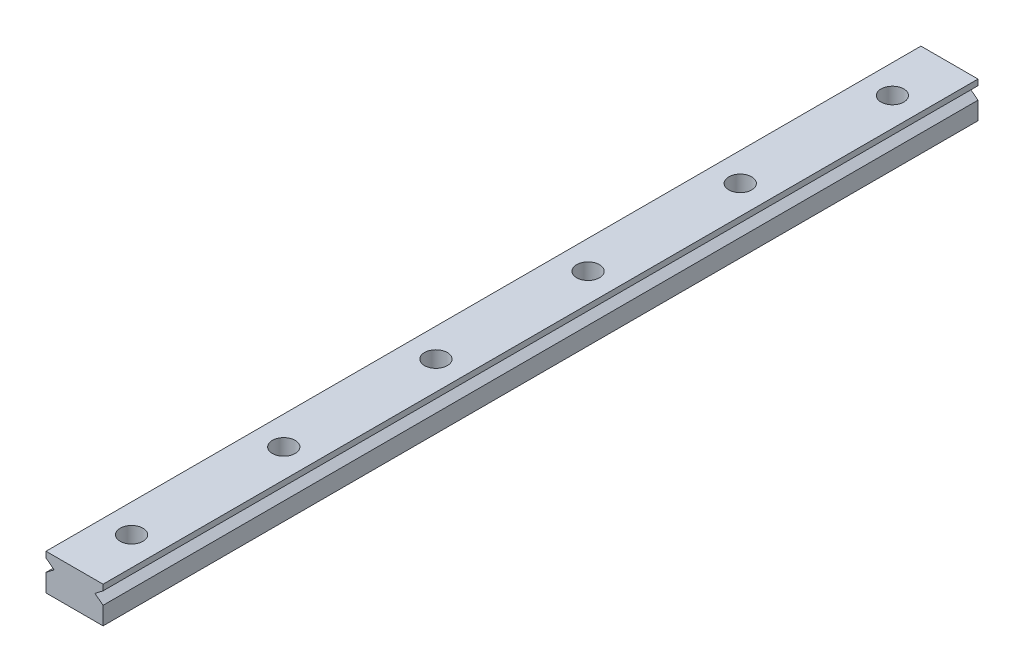
ISO-10303-21;
HEADER;
FILE_DESCRIPTION(('STEP AP214'),'2;1');
FILE_NAME('part.step','',(''),(''),'','','');
FILE_SCHEMA(('AUTOMOTIVE_DESIGN { 1 0 10303 214 1 1 1 1 }'));
ENDSEC;
DATA;
#1=APPLICATION_CONTEXT('core data for automotive mechanical design processes');
#2=APPLICATION_PROTOCOL_DEFINITION('international standard','automotive_design',2000,#1);
#3=PRODUCT_CONTEXT('',#1,'mechanical');
#4=PRODUCT('Part','Part','',(#3));
#5=PRODUCT_RELATED_PRODUCT_CATEGORY('part','',(#4));
#6=PRODUCT_DEFINITION_FORMATION('','',#4);
#7=PRODUCT_DEFINITION_CONTEXT('part definition',#1,'design');
#8=PRODUCT_DEFINITION('design','',#6,#7);
#9=PRODUCT_DEFINITION_SHAPE('','',#8);
#10=(LENGTH_UNIT() NAMED_UNIT(*) SI_UNIT(.MILLI.,.METRE.));
#11=(NAMED_UNIT(*) PLANE_ANGLE_UNIT() SI_UNIT($,.RADIAN.));
#12=(NAMED_UNIT(*) SI_UNIT($,.STERADIAN.) SOLID_ANGLE_UNIT());
#13=UNCERTAINTY_MEASURE_WITH_UNIT(LENGTH_MEASURE(1.E-05),#10,'distance_accuracy_value','');
#14=(GEOMETRIC_REPRESENTATION_CONTEXT(3) GLOBAL_UNCERTAINTY_ASSIGNED_CONTEXT((#13)) GLOBAL_UNIT_ASSIGNED_CONTEXT((#10,
#11,#12)) REPRESENTATION_CONTEXT('',''));
#15=CARTESIAN_POINT('',(0.,0.,0.));
#16=DIRECTION('',(0.,0.,1.));
#17=DIRECTION('',(1.,0.,0.));
#18=AXIS2_PLACEMENT_3D('',#15,#16,#17);
#19=CARTESIAN_POINT('',(-7.5,9.5,-230.));
#20=DIRECTION('',(0.,1.,0.));
#21=DIRECTION('',(0.,0.,1.));
#22=AXIS2_PLACEMENT_3D('',#19,#20,#21);
#23=PLANE('',#22);
#24=CARTESIAN_POINT('',(0.,9.5,-55.));
#25=DIRECTION('',(0.,1.,0.));
#26=DIRECTION('',(0.,0.,1.));
#27=AXIS2_PLACEMENT_3D('',#24,#25,#26);
#28=CIRCLE('',#27,3.);
#29=CARTESIAN_POINT('',(0.,9.5,-52.));
#30=VERTEX_POINT('',#29);
#31=EDGE_CURVE('E301',#30,#30,#28,.T.);
#32=ORIENTED_EDGE('',*,*,#31,.F.);
#33=EDGE_LOOP('',(#32));
#34=FACE_BOUND('',#33,.T.);
#35=CARTESIAN_POINT('',(0.,9.5,-135.));
#36=DIRECTION('',(0.,1.,0.));
#37=DIRECTION('',(0.,0.,1.));
#38=AXIS2_PLACEMENT_3D('',#35,#36,#37);
#39=CIRCLE('',#38,3.);
#40=CARTESIAN_POINT('',(0.,9.5,-132.));
#41=VERTEX_POINT('',#40);
#42=EDGE_CURVE('E277',#41,#41,#39,.T.);
#43=ORIENTED_EDGE('',*,*,#42,.F.);
#44=EDGE_LOOP('',(#43));
#45=FACE_BOUND('',#44,.T.);
#46=CARTESIAN_POINT('',(0.,9.5,-215.));
#47=DIRECTION('',(0.,1.,0.));
#48=DIRECTION('',(0.,0.,1.));
#49=AXIS2_PLACEMENT_3D('',#46,#47,#48);
#50=CIRCLE('',#49,3.);
#51=CARTESIAN_POINT('',(0.,9.5,-212.));
#52=VERTEX_POINT('',#51);
#53=EDGE_CURVE('E151',#52,#52,#50,.T.);
#54=ORIENTED_EDGE('',*,*,#53,.F.);
#55=EDGE_LOOP('',(#54));
#56=FACE_BOUND('',#55,.T.);
#57=DIRECTION('',(-1.,0.,0.));
#58=VECTOR('',#57,1.);
#59=CARTESIAN_POINT('',(-7.5,9.5,0.));
#60=LINE('',#59,#58);
#61=CARTESIAN_POINT('',(7.5,9.5,0.));
#62=VERTEX_POINT('',#61);
#63=CARTESIAN_POINT('',(-7.5,9.5,0.));
#64=VERTEX_POINT('',#63);
#65=EDGE_CURVE('E166',#62,#64,#60,.T.);
#66=ORIENTED_EDGE('',*,*,#65,.F.);
#67=DIRECTION('',(0.,0.,1.));
#68=VECTOR('',#67,1.);
#69=CARTESIAN_POINT('',(7.5,9.5,-230.));
#70=LINE('',#69,#68);
#71=CARTESIAN_POINT('',(7.5,9.5,-230.));
#72=VERTEX_POINT('',#71);
#73=EDGE_CURVE('E178',#72,#62,#70,.T.);
#74=ORIENTED_EDGE('',*,*,#73,.F.);
#75=DIRECTION('',(-1.,0.,0.));
#76=VECTOR('',#75,1.);
#77=CARTESIAN_POINT('',(-7.5,9.5,-230.));
#78=LINE('',#77,#76);
#79=CARTESIAN_POINT('',(-7.5,9.5,-230.));
#80=VERTEX_POINT('',#79);
#81=EDGE_CURVE('E140',#72,#80,#78,.T.);
#82=ORIENTED_EDGE('',*,*,#81,.T.);
#83=DIRECTION('',(0.,0.,1.));
#84=VECTOR('',#83,1.);
#85=CARTESIAN_POINT('',(-7.5,9.5,-230.));
#86=LINE('',#85,#84);
#87=EDGE_CURVE('E129',#80,#64,#86,.T.);
#88=ORIENTED_EDGE('',*,*,#87,.T.);
#89=EDGE_LOOP('',(#66,#74,#82,#88));
#90=FACE_BOUND('',#89,.T.);
#91=CARTESIAN_POINT('',(0.,9.5,-175.));
#92=DIRECTION('',(0.,1.,0.));
#93=DIRECTION('',(0.,0.,1.));
#94=AXIS2_PLACEMENT_3D('',#91,#92,#93);
#95=CIRCLE('',#94,3.);
#96=CARTESIAN_POINT('',(0.,9.5,-172.));
#97=VERTEX_POINT('',#96);
#98=EDGE_CURVE('E265',#97,#97,#95,.T.);
#99=ORIENTED_EDGE('',*,*,#98,.F.);
#100=EDGE_LOOP('',(#99));
#101=FACE_BOUND('',#100,.T.);
#102=CARTESIAN_POINT('',(0.,9.5,-95.));
#103=DIRECTION('',(0.,1.,0.));
#104=DIRECTION('',(0.,0.,1.));
#105=AXIS2_PLACEMENT_3D('',#102,#103,#104);
#106=CIRCLE('',#105,3.);
#107=CARTESIAN_POINT('',(0.,9.5,-92.));
#108=VERTEX_POINT('',#107);
#109=EDGE_CURVE('E289',#108,#108,#106,.T.);
#110=ORIENTED_EDGE('',*,*,#109,.F.);
#111=EDGE_LOOP('',(#110));
#112=FACE_BOUND('',#111,.T.);
#113=CARTESIAN_POINT('',(0.,9.5,-15.));
#114=DIRECTION('',(0.,1.,0.));
#115=DIRECTION('',(0.,0.,1.));
#116=AXIS2_PLACEMENT_3D('',#113,#114,#115);
#117=CIRCLE('',#116,3.);
#118=CARTESIAN_POINT('',(0.,9.5,-12.));
#119=VERTEX_POINT('',#118);
#120=EDGE_CURVE('E313',#119,#119,#117,.T.);
#121=ORIENTED_EDGE('',*,*,#120,.F.);
#122=EDGE_LOOP('',(#121));
#123=FACE_BOUND('',#122,.T.);
#124=ADVANCED_FACE('F37',(#34,#45,#56,#90,#101,#112,#123),#23,.T.);
#125=CARTESIAN_POINT('',(-7.5,0.,-230.));
#126=DIRECTION('',(0.,-1.,0.));
#127=DIRECTION('',(0.,0.,-1.));
#128=AXIS2_PLACEMENT_3D('',#125,#126,#127);
#129=PLANE('',#128);
#130=CARTESIAN_POINT('',(0.,0.,-55.));
#131=DIRECTION('',(0.,1.,0.));
#132=DIRECTION('',(0.,0.,1.));
#133=AXIS2_PLACEMENT_3D('',#130,#131,#132);
#134=CIRCLE('',#133,1.74999999999997);
#135=CARTESIAN_POINT('',(0.,0.,-53.25));
#136=VERTEX_POINT('',#135);
#137=EDGE_CURVE('E310',#136,#136,#134,.T.);
#138=ORIENTED_EDGE('',*,*,#137,.T.);
#139=EDGE_LOOP('',(#138));
#140=FACE_BOUND('',#139,.T.);
#141=CARTESIAN_POINT('',(0.,0.,-135.));
#142=DIRECTION('',(0.,1.,0.));
#143=DIRECTION('',(0.,0.,1.));
#144=AXIS2_PLACEMENT_3D('',#141,#142,#143);
#145=CIRCLE('',#144,1.74999999999997);
#146=CARTESIAN_POINT('',(0.,0.,-133.25));
#147=VERTEX_POINT('',#146);
#148=EDGE_CURVE('E286',#147,#147,#145,.T.);
#149=ORIENTED_EDGE('',*,*,#148,.T.);
#150=EDGE_LOOP('',(#149));
#151=FACE_BOUND('',#150,.T.);
#152=CARTESIAN_POINT('',(0.,0.,-215.));
#153=DIRECTION('',(0.,1.,0.));
#154=DIRECTION('',(0.,0.,1.));
#155=AXIS2_PLACEMENT_3D('',#152,#153,#154);
#156=CIRCLE('',#155,1.74999999999997);
#157=CARTESIAN_POINT('',(0.,0.,-213.25));
#158=VERTEX_POINT('',#157);
#159=EDGE_CURVE('E262',#158,#158,#156,.T.);
#160=ORIENTED_EDGE('',*,*,#159,.T.);
#161=EDGE_LOOP('',(#160));
#162=FACE_BOUND('',#161,.T.);
#163=DIRECTION('',(1.,0.,0.));
#164=VECTOR('',#163,1.);
#165=CARTESIAN_POINT('',(-7.5,0.,0.));
#166=LINE('',#165,#164);
#167=CARTESIAN_POINT('',(-7.5,0.,0.));
#168=VERTEX_POINT('',#167);
#169=CARTESIAN_POINT('',(7.5,0.,0.));
#170=VERTEX_POINT('',#169);
#171=EDGE_CURVE('E150',#168,#170,#166,.T.);
#172=ORIENTED_EDGE('',*,*,#171,.F.);
#173=DIRECTION('',(0.,0.,1.));
#174=VECTOR('',#173,1.);
#175=CARTESIAN_POINT('',(-7.5,0.,-230.));
#176=LINE('',#175,#174);
#177=CARTESIAN_POINT('',(-7.5,0.,-230.));
#178=VERTEX_POINT('',#177);
#179=EDGE_CURVE('E41',#178,#168,#176,.T.);
#180=ORIENTED_EDGE('',*,*,#179,.F.);
#181=DIRECTION('',(1.,0.,0.));
#182=VECTOR('',#181,1.);
#183=CARTESIAN_POINT('',(-7.5,0.,-230.));
#184=LINE('',#183,#182);
#185=CARTESIAN_POINT('',(7.5,0.,-230.));
#186=VERTEX_POINT('',#185);
#187=EDGE_CURVE('E251',#178,#186,#184,.T.);
#188=ORIENTED_EDGE('',*,*,#187,.T.);
#189=DIRECTION('',(0.,0.,1.));
#190=VECTOR('',#189,1.);
#191=CARTESIAN_POINT('',(7.5,0.,-230.));
#192=LINE('',#191,#190);
#193=EDGE_CURVE('E185',#186,#170,#192,.T.);
#194=ORIENTED_EDGE('',*,*,#193,.T.);
#195=EDGE_LOOP('',(#172,#180,#188,#194));
#196=FACE_BOUND('',#195,.T.);
#197=CARTESIAN_POINT('',(0.,0.,-175.));
#198=DIRECTION('',(0.,1.,0.));
#199=DIRECTION('',(0.,0.,1.));
#200=AXIS2_PLACEMENT_3D('',#197,#198,#199);
#201=CIRCLE('',#200,1.74999999999997);
#202=CARTESIAN_POINT('',(0.,0.,-173.25));
#203=VERTEX_POINT('',#202);
#204=EDGE_CURVE('E274',#203,#203,#201,.T.);
#205=ORIENTED_EDGE('',*,*,#204,.T.);
#206=EDGE_LOOP('',(#205));
#207=FACE_BOUND('',#206,.T.);
#208=CARTESIAN_POINT('',(0.,0.,-95.));
#209=DIRECTION('',(0.,1.,0.));
#210=DIRECTION('',(0.,0.,1.));
#211=AXIS2_PLACEMENT_3D('',#208,#209,#210);
#212=CIRCLE('',#211,1.74999999999997);
#213=CARTESIAN_POINT('',(0.,0.,-93.2500000000001));
#214=VERTEX_POINT('',#213);
#215=EDGE_CURVE('E298',#214,#214,#212,.T.);
#216=ORIENTED_EDGE('',*,*,#215,.T.);
#217=EDGE_LOOP('',(#216));
#218=FACE_BOUND('',#217,.T.);
#219=CARTESIAN_POINT('',(0.,0.,-15.));
#220=DIRECTION('',(0.,1.,0.));
#221=DIRECTION('',(0.,0.,1.));
#222=AXIS2_PLACEMENT_3D('',#219,#220,#221);
#223=CIRCLE('',#222,1.74999999999997);
#224=CARTESIAN_POINT('',(0.,0.,-13.25));
#225=VERTEX_POINT('',#224);
#226=EDGE_CURVE('E322',#225,#225,#223,.T.);
#227=ORIENTED_EDGE('',*,*,#226,.T.);
#228=EDGE_LOOP('',(#227));
#229=FACE_BOUND('',#228,.T.);
#230=ADVANCED_FACE('F187',(#140,#151,#162,#196,#207,#218,#229),#129,.T.);
#231=CARTESIAN_POINT('',(-7.5,0.,-230.));
#232=DIRECTION('',(-1.,0.,0.));
#233=DIRECTION('',(0.,0.,1.));
#234=AXIS2_PLACEMENT_3D('',#231,#232,#233);
#235=PLANE('',#234);
#236=DIRECTION('',(0.,-1.,0.));
#237=VECTOR('',#236,1.);
#238=CARTESIAN_POINT('',(-7.5,0.,0.));
#239=LINE('',#238,#237);
#240=CARTESIAN_POINT('',(-7.5,4.68906121623557,0.));
#241=VERTEX_POINT('',#240);
#242=EDGE_CURVE('E147',#241,#168,#239,.T.);
#243=ORIENTED_EDGE('',*,*,#242,.F.);
#244=DIRECTION('',(0.,0.,1.));
#245=VECTOR('',#244,1.);
#246=CARTESIAN_POINT('',(-7.5,4.68906121623557,-230.));
#247=LINE('',#246,#245);
#248=CARTESIAN_POINT('',(-7.5,4.68906121623557,-230.));
#249=VERTEX_POINT('',#248);
#250=EDGE_CURVE('E11',#249,#241,#247,.T.);
#251=ORIENTED_EDGE('',*,*,#250,.F.);
#252=DIRECTION('',(0.,-1.,0.));
#253=VECTOR('',#252,1.);
#254=CARTESIAN_POINT('',(-7.5,0.,-230.));
#255=LINE('',#254,#253);
#256=EDGE_CURVE('E174',#249,#178,#255,.T.);
#257=ORIENTED_EDGE('',*,*,#256,.T.);
#258=ORIENTED_EDGE('',*,*,#179,.T.);
#259=EDGE_LOOP('',(#243,#251,#257,#258));
#260=FACE_BOUND('',#259,.T.);
#261=ADVANCED_FACE('F39',(#260),#235,.T.);
#262=CARTESIAN_POINT('',(-5.35714285714286,6.33333333333333,-230.));
#263=DIRECTION('',(-0.608761429008718,0.793353340291237,0.));
#264=DIRECTION('',(-0.793353340291238,-0.608761429008718,0.));
#265=AXIS2_PLACEMENT_3D('',#262,#263,#264);
#266=PLANE('',#265);
#267=DIRECTION('',(-0.793353340291238,-0.608761429008718,0.));
#268=VECTOR('',#267,1.);
#269=CARTESIAN_POINT('',(-5.35714285714286,6.33333333333333,0.));
#270=LINE('',#269,#268);
#271=CARTESIAN_POINT('',(-5.35714285714286,6.33333333333333,0.));
#272=VERTEX_POINT('',#271);
#273=EDGE_CURVE('E172',#272,#241,#270,.T.);
#274=ORIENTED_EDGE('',*,*,#273,.F.);
#275=DIRECTION('',(0.,0.,1.));
#276=VECTOR('',#275,1.);
#277=CARTESIAN_POINT('',(-5.35714285714286,6.33333333333333,-230.));
#278=LINE('',#277,#276);
#279=CARTESIAN_POINT('',(-5.35714285714286,6.33333333333333,-230.));
#280=VERTEX_POINT('',#279);
#281=EDGE_CURVE('E47',#280,#272,#278,.T.);
#282=ORIENTED_EDGE('',*,*,#281,.F.);
#283=DIRECTION('',(-0.793353340291238,-0.608761429008718,0.));
#284=VECTOR('',#283,1.);
#285=CARTESIAN_POINT('',(-5.35714285714286,6.33333333333333,-230.));
#286=LINE('',#285,#284);
#287=EDGE_CURVE('E137',#280,#249,#286,.T.);
#288=ORIENTED_EDGE('',*,*,#287,.T.);
#289=ORIENTED_EDGE('',*,*,#250,.T.);
#290=EDGE_LOOP('',(#274,#282,#288,#289));
#291=FACE_BOUND('',#290,.T.);
#292=ADVANCED_FACE('F191',(#291),#266,.T.);
#293=CARTESIAN_POINT('',(-7.5,7.97760545043109,-230.));
#294=DIRECTION('',(-0.608761429008718,-0.793353340291237,0.));
#295=DIRECTION('',(0.793353340291238,-0.608761429008718,0.));
#296=AXIS2_PLACEMENT_3D('',#293,#294,#295);
#297=PLANE('',#296);
#298=DIRECTION('',(0.793353340291238,-0.608761429008718,0.));
#299=VECTOR('',#298,1.);
#300=CARTESIAN_POINT('',(-7.5,7.97760545043109,0.));
#301=LINE('',#300,#299);
#302=CARTESIAN_POINT('',(-7.5,7.97760545043109,0.));
#303=VERTEX_POINT('',#302);
#304=EDGE_CURVE('E124',#303,#272,#301,.T.);
#305=ORIENTED_EDGE('',*,*,#304,.F.);
#306=DIRECTION('',(0.,0.,1.));
#307=VECTOR('',#306,1.);
#308=CARTESIAN_POINT('',(-7.5,7.97760545043109,-230.));
#309=LINE('',#308,#307);
#310=CARTESIAN_POINT('',(-7.5,7.97760545043109,-230.));
#311=VERTEX_POINT('',#310);
#312=EDGE_CURVE('E119',#311,#303,#309,.T.);
#313=ORIENTED_EDGE('',*,*,#312,.F.);
#314=DIRECTION('',(0.793353340291238,-0.608761429008718,0.));
#315=VECTOR('',#314,1.);
#316=CARTESIAN_POINT('',(-7.5,7.97760545043109,-230.));
#317=LINE('',#316,#315);
#318=EDGE_CURVE('E122',#311,#280,#317,.T.);
#319=ORIENTED_EDGE('',*,*,#318,.T.);
#320=ORIENTED_EDGE('',*,*,#281,.T.);
#321=EDGE_LOOP('',(#305,#313,#319,#320));
#322=FACE_BOUND('',#321,.T.);
#323=ADVANCED_FACE('F121',(#322),#297,.T.);
#324=CARTESIAN_POINT('',(-7.5,7.97760545043109,-230.));
#325=DIRECTION('',(-1.,0.,0.));
#326=DIRECTION('',(0.,0.,1.));
#327=AXIS2_PLACEMENT_3D('',#324,#325,#326);
#328=PLANE('',#327);
#329=DIRECTION('',(0.,-1.,0.));
#330=VECTOR('',#329,1.);
#331=CARTESIAN_POINT('',(-7.5,7.97760545043109,0.));
#332=LINE('',#331,#330);
#333=EDGE_CURVE('E169',#64,#303,#332,.T.);
#334=ORIENTED_EDGE('',*,*,#333,.F.);
#335=ORIENTED_EDGE('',*,*,#87,.F.);
#336=DIRECTION('',(0.,-1.,0.));
#337=VECTOR('',#336,1.);
#338=CARTESIAN_POINT('',(-7.5,7.97760545043109,-230.));
#339=LINE('',#338,#337);
#340=EDGE_CURVE('E135',#80,#311,#339,.T.);
#341=ORIENTED_EDGE('',*,*,#340,.T.);
#342=ORIENTED_EDGE('',*,*,#312,.T.);
#343=EDGE_LOOP('',(#334,#335,#341,#342));
#344=FACE_BOUND('',#343,.T.);
#345=ADVANCED_FACE('F139',(#344),#328,.T.);
#346=CARTESIAN_POINT('',(7.5,7.97760545043109,-230.));
#347=DIRECTION('',(1.,0.,0.));
#348=DIRECTION('',(0.,0.,-1.));
#349=AXIS2_PLACEMENT_3D('',#346,#347,#348);
#350=PLANE('',#349);
#351=DIRECTION('',(0.,1.,0.));
#352=VECTOR('',#351,1.);
#353=CARTESIAN_POINT('',(7.5,7.97760545043109,0.));
#354=LINE('',#353,#352);
#355=CARTESIAN_POINT('',(7.5,7.97760545043109,0.));
#356=VERTEX_POINT('',#355);
#357=EDGE_CURVE('E163',#356,#62,#354,.T.);
#358=ORIENTED_EDGE('',*,*,#357,.F.);
#359=DIRECTION('',(0.,0.,1.));
#360=VECTOR('',#359,1.);
#361=CARTESIAN_POINT('',(7.5,7.97760545043109,-230.));
#362=LINE('',#361,#360);
#363=CARTESIAN_POINT('',(7.5,7.97760545043109,-230.));
#364=VERTEX_POINT('',#363);
#365=EDGE_CURVE('E180',#364,#356,#362,.T.);
#366=ORIENTED_EDGE('',*,*,#365,.F.);
#367=DIRECTION('',(0.,1.,0.));
#368=VECTOR('',#367,1.);
#369=CARTESIAN_POINT('',(7.5,7.97760545043109,-230.));
#370=LINE('',#369,#368);
#371=EDGE_CURVE('E142',#364,#72,#370,.T.);
#372=ORIENTED_EDGE('',*,*,#371,.T.);
#373=ORIENTED_EDGE('',*,*,#73,.T.);
#374=EDGE_LOOP('',(#358,#366,#372,#373));
#375=FACE_BOUND('',#374,.T.);
#376=ADVANCED_FACE('F211',(#375),#350,.T.);
#377=CARTESIAN_POINT('',(7.5,7.97760545043109,-230.));
#378=DIRECTION('',(0.608761429008718,-0.793353340291237,0.));
#379=DIRECTION('',(0.793353340291238,0.608761429008718,0.));
#380=AXIS2_PLACEMENT_3D('',#377,#378,#379);
#381=PLANE('',#380);
#382=DIRECTION('',(0.793353340291238,0.608761429008718,0.));
#383=VECTOR('',#382,1.);
#384=CARTESIAN_POINT('',(7.5,7.97760545043109,0.));
#385=LINE('',#384,#383);
#386=CARTESIAN_POINT('',(5.35714285714286,6.33333333333333,0.));
#387=VERTEX_POINT('',#386);
#388=EDGE_CURVE('E160',#387,#356,#385,.T.);
#389=ORIENTED_EDGE('',*,*,#388,.F.);
#390=DIRECTION('',(0.,0.,1.));
#391=VECTOR('',#390,1.);
#392=CARTESIAN_POINT('',(5.35714285714286,6.33333333333333,-230.));
#393=LINE('',#392,#391);
#394=CARTESIAN_POINT('',(5.35714285714286,6.33333333333333,-230.));
#395=VERTEX_POINT('',#394);
#396=EDGE_CURVE('E182',#395,#387,#393,.T.);
#397=ORIENTED_EDGE('',*,*,#396,.F.);
#398=DIRECTION('',(0.793353340291238,0.608761429008718,0.));
#399=VECTOR('',#398,1.);
#400=CARTESIAN_POINT('',(7.5,7.97760545043109,-230.));
#401=LINE('',#400,#399);
#402=EDGE_CURVE('E240',#395,#364,#401,.T.);
#403=ORIENTED_EDGE('',*,*,#402,.T.);
#404=ORIENTED_EDGE('',*,*,#365,.T.);
#405=EDGE_LOOP('',(#389,#397,#403,#404));
#406=FACE_BOUND('',#405,.T.);
#407=ADVANCED_FACE('F214',(#406),#381,.T.);
#408=CARTESIAN_POINT('',(5.35714285714286,6.33333333333333,-230.));
#409=DIRECTION('',(0.608761429008718,0.793353340291237,0.));
#410=DIRECTION('',(-0.793353340291238,0.608761429008718,0.));
#411=AXIS2_PLACEMENT_3D('',#408,#409,#410);
#412=PLANE('',#411);
#413=DIRECTION('',(-0.793353340291238,0.608761429008718,0.));
#414=VECTOR('',#413,1.);
#415=CARTESIAN_POINT('',(5.35714285714286,6.33333333333333,0.));
#416=LINE('',#415,#414);
#417=CARTESIAN_POINT('',(7.5,4.68906121623557,0.));
#418=VERTEX_POINT('',#417);
#419=EDGE_CURVE('E157',#418,#387,#416,.T.);
#420=ORIENTED_EDGE('',*,*,#419,.F.);
#421=DIRECTION('',(0.,0.,1.));
#422=VECTOR('',#421,1.);
#423=CARTESIAN_POINT('',(7.5,4.68906121623557,-230.));
#424=LINE('',#423,#422);
#425=CARTESIAN_POINT('',(7.5,4.68906121623557,-230.));
#426=VERTEX_POINT('',#425);
#427=EDGE_CURVE('E184',#426,#418,#424,.T.);
#428=ORIENTED_EDGE('',*,*,#427,.F.);
#429=DIRECTION('',(-0.793353340291238,0.608761429008718,0.));
#430=VECTOR('',#429,1.);
#431=CARTESIAN_POINT('',(5.35714285714286,6.33333333333333,-230.));
#432=LINE('',#431,#430);
#433=EDGE_CURVE('E236',#426,#395,#432,.T.);
#434=ORIENTED_EDGE('',*,*,#433,.T.);
#435=ORIENTED_EDGE('',*,*,#396,.T.);
#436=EDGE_LOOP('',(#420,#428,#434,#435));
#437=FACE_BOUND('',#436,.T.);
#438=ADVANCED_FACE('F218',(#437),#412,.T.);
#439=CARTESIAN_POINT('',(7.5,0.,-230.));
#440=DIRECTION('',(1.,0.,0.));
#441=DIRECTION('',(0.,0.,-1.));
#442=AXIS2_PLACEMENT_3D('',#439,#440,#441);
#443=PLANE('',#442);
#444=DIRECTION('',(0.,1.,0.));
#445=VECTOR('',#444,1.);
#446=CARTESIAN_POINT('',(7.5,0.,0.));
#447=LINE('',#446,#445);
#448=EDGE_CURVE('E154',#170,#418,#447,.T.);
#449=ORIENTED_EDGE('',*,*,#448,.F.);
#450=ORIENTED_EDGE('',*,*,#193,.F.);
#451=DIRECTION('',(0.,1.,0.));
#452=VECTOR('',#451,1.);
#453=CARTESIAN_POINT('',(7.5,0.,-230.));
#454=LINE('',#453,#452);
#455=EDGE_CURVE('E249',#186,#426,#454,.T.);
#456=ORIENTED_EDGE('',*,*,#455,.T.);
#457=ORIENTED_EDGE('',*,*,#427,.T.);
#458=EDGE_LOOP('',(#449,#450,#456,#457));
#459=FACE_BOUND('',#458,.T.);
#460=ADVANCED_FACE('F222',(#459),#443,.T.);
#461=CARTESIAN_POINT('',(-7.5,9.5,-230.));
#462=DIRECTION('',(0.,0.,-1.));
#463=DIRECTION('',(-1.,0.,0.));
#464=AXIS2_PLACEMENT_3D('',#461,#462,#463);
#465=PLANE('',#464);
#466=ORIENTED_EDGE('',*,*,#256,.F.);
#467=ORIENTED_EDGE('',*,*,#287,.F.);
#468=ORIENTED_EDGE('',*,*,#318,.F.);
#469=ORIENTED_EDGE('',*,*,#340,.F.);
#470=ORIENTED_EDGE('',*,*,#81,.F.);
#471=ORIENTED_EDGE('',*,*,#371,.F.);
#472=ORIENTED_EDGE('',*,*,#402,.F.);
#473=ORIENTED_EDGE('',*,*,#433,.F.);
#474=ORIENTED_EDGE('',*,*,#455,.F.);
#475=ORIENTED_EDGE('',*,*,#187,.F.);
#476=EDGE_LOOP('',(#466,#467,#468,#469,#470,#471,#472,#473,#474,#475));
#477=FACE_BOUND('',#476,.T.);
#478=ADVANCED_FACE('F133',(#477),#465,.T.);
#479=CARTESIAN_POINT('',(-7.5,9.5,0.));
#480=DIRECTION('',(0.,0.,-1.));
#481=DIRECTION('',(-1.,0.,0.));
#482=AXIS2_PLACEMENT_3D('',#479,#480,#481);
#483=PLANE('',#482);
#484=ORIENTED_EDGE('',*,*,#242,.T.);
#485=ORIENTED_EDGE('',*,*,#171,.T.);
#486=ORIENTED_EDGE('',*,*,#448,.T.);
#487=ORIENTED_EDGE('',*,*,#419,.T.);
#488=ORIENTED_EDGE('',*,*,#388,.T.);
#489=ORIENTED_EDGE('',*,*,#357,.T.);
#490=ORIENTED_EDGE('',*,*,#65,.T.);
#491=ORIENTED_EDGE('',*,*,#333,.T.);
#492=ORIENTED_EDGE('',*,*,#304,.T.);
#493=ORIENTED_EDGE('',*,*,#273,.T.);
#494=EDGE_LOOP('',(#484,#485,#486,#487,#488,#489,#490,#491,#492,#493));
#495=FACE_BOUND('',#494,.T.);
#496=ADVANCED_FACE('F190',(#495),#483,.F.);
#497=CARTESIAN_POINT('',(0.,8.90490543455157,-215.));
#498=DIRECTION('',(0.,1.,0.));
#499=DIRECTION('',(0.,0.,1.));
#500=AXIS2_PLACEMENT_3D('',#497,#498,#499);
#501=CYLINDRICAL_SURFACE('',#500,3.);
#502=ORIENTED_EDGE('',*,*,#53,.T.);
#503=EDGE_LOOP('',(#502));
#504=FACE_BOUND('',#503,.T.);
#505=CARTESIAN_POINT('',(0.,5.,-215.));
#506=DIRECTION('',(0.,1.,0.));
#507=DIRECTION('',(0.,0.,1.));
#508=AXIS2_PLACEMENT_3D('',#505,#506,#507);
#509=CIRCLE('',#508,3.);
#510=CARTESIAN_POINT('',(0.,5.,-212.));
#511=VERTEX_POINT('',#510);
#512=EDGE_CURVE('E256',#511,#511,#509,.T.);
#513=ORIENTED_EDGE('',*,*,#512,.F.);
#514=EDGE_LOOP('',(#513));
#515=FACE_BOUND('',#514,.T.);
#516=ADVANCED_FACE('F397',(#504,#515),#501,.F.);
#517=CARTESIAN_POINT('',(0.,5.,-218.));
#518=DIRECTION('',(0.,1.,0.));
#519=DIRECTION('',(0.,0.,1.));
#520=AXIS2_PLACEMENT_3D('',#517,#518,#519);
#521=PLANE('',#520);
#522=ORIENTED_EDGE('',*,*,#512,.T.);
#523=EDGE_LOOP('',(#522));
#524=FACE_BOUND('',#523,.T.);
#525=CARTESIAN_POINT('',(0.,5.,-215.));
#526=DIRECTION('',(0.,1.,0.));
#527=DIRECTION('',(0.,0.,1.));
#528=AXIS2_PLACEMENT_3D('',#525,#526,#527);
#529=CIRCLE('',#528,1.74999999999997);
#530=CARTESIAN_POINT('',(0.,5.,-213.25));
#531=VERTEX_POINT('',#530);
#532=EDGE_CURVE('E259',#531,#531,#529,.T.);
#533=ORIENTED_EDGE('',*,*,#532,.F.);
#534=EDGE_LOOP('',(#533));
#535=FACE_BOUND('',#534,.T.);
#536=ADVANCED_FACE('F393',(#524,#535),#521,.T.);
#537=CARTESIAN_POINT('',(0.,8.90490543455157,-215.));
#538=DIRECTION('',(0.,1.,0.));
#539=DIRECTION('',(0.,0.,1.));
#540=AXIS2_PLACEMENT_3D('',#537,#538,#539);
#541=CYLINDRICAL_SURFACE('',#540,1.74999999999997);
#542=ORIENTED_EDGE('',*,*,#532,.T.);
#543=EDGE_LOOP('',(#542));
#544=FACE_BOUND('',#543,.T.);
#545=ORIENTED_EDGE('',*,*,#159,.F.);
#546=EDGE_LOOP('',(#545));
#547=FACE_BOUND('',#546,.T.);
#548=ADVANCED_FACE('F389',(#544,#547),#541,.F.);
#549=CARTESIAN_POINT('',(0.,8.90490543455157,-175.));
#550=DIRECTION('',(0.,1.,0.));
#551=DIRECTION('',(0.,0.,1.));
#552=AXIS2_PLACEMENT_3D('',#549,#550,#551);
#553=CYLINDRICAL_SURFACE('',#552,3.);
#554=ORIENTED_EDGE('',*,*,#98,.T.);
#555=EDGE_LOOP('',(#554));
#556=FACE_BOUND('',#555,.T.);
#557=CARTESIAN_POINT('',(0.,5.,-175.));
#558=DIRECTION('',(0.,1.,0.));
#559=DIRECTION('',(0.,0.,1.));
#560=AXIS2_PLACEMENT_3D('',#557,#558,#559);
#561=CIRCLE('',#560,3.);
#562=CARTESIAN_POINT('',(0.,5.,-172.));
#563=VERTEX_POINT('',#562);
#564=EDGE_CURVE('E268',#563,#563,#561,.T.);
#565=ORIENTED_EDGE('',*,*,#564,.F.);
#566=EDGE_LOOP('',(#565));
#567=FACE_BOUND('',#566,.T.);
#568=ADVANCED_FACE('F385',(#556,#567),#553,.F.);
#569=CARTESIAN_POINT('',(0.,5.,-178.));
#570=DIRECTION('',(0.,1.,0.));
#571=DIRECTION('',(0.,0.,1.));
#572=AXIS2_PLACEMENT_3D('',#569,#570,#571);
#573=PLANE('',#572);
#574=ORIENTED_EDGE('',*,*,#564,.T.);
#575=EDGE_LOOP('',(#574));
#576=FACE_BOUND('',#575,.T.);
#577=CARTESIAN_POINT('',(0.,5.,-175.));
#578=DIRECTION('',(0.,1.,0.));
#579=DIRECTION('',(0.,0.,1.));
#580=AXIS2_PLACEMENT_3D('',#577,#578,#579);
#581=CIRCLE('',#580,1.74999999999997);
#582=CARTESIAN_POINT('',(0.,5.,-173.25));
#583=VERTEX_POINT('',#582);
#584=EDGE_CURVE('E271',#583,#583,#581,.T.);
#585=ORIENTED_EDGE('',*,*,#584,.F.);
#586=EDGE_LOOP('',(#585));
#587=FACE_BOUND('',#586,.T.);
#588=ADVANCED_FACE('F381',(#576,#587),#573,.T.);
#589=CARTESIAN_POINT('',(0.,8.90490543455157,-175.));
#590=DIRECTION('',(0.,1.,0.));
#591=DIRECTION('',(0.,0.,1.));
#592=AXIS2_PLACEMENT_3D('',#589,#590,#591);
#593=CYLINDRICAL_SURFACE('',#592,1.74999999999997);
#594=ORIENTED_EDGE('',*,*,#584,.T.);
#595=EDGE_LOOP('',(#594));
#596=FACE_BOUND('',#595,.T.);
#597=ORIENTED_EDGE('',*,*,#204,.F.);
#598=EDGE_LOOP('',(#597));
#599=FACE_BOUND('',#598,.T.);
#600=ADVANCED_FACE('F377',(#596,#599),#593,.F.);
#601=CARTESIAN_POINT('',(0.,8.90490543455157,-135.));
#602=DIRECTION('',(0.,1.,0.));
#603=DIRECTION('',(0.,0.,1.));
#604=AXIS2_PLACEMENT_3D('',#601,#602,#603);
#605=CYLINDRICAL_SURFACE('',#604,3.);
#606=ORIENTED_EDGE('',*,*,#42,.T.);
#607=EDGE_LOOP('',(#606));
#608=FACE_BOUND('',#607,.T.);
#609=CARTESIAN_POINT('',(0.,5.,-135.));
#610=DIRECTION('',(0.,1.,0.));
#611=DIRECTION('',(0.,0.,1.));
#612=AXIS2_PLACEMENT_3D('',#609,#610,#611);
#613=CIRCLE('',#612,3.);
#614=CARTESIAN_POINT('',(0.,5.,-132.));
#615=VERTEX_POINT('',#614);
#616=EDGE_CURVE('E280',#615,#615,#613,.T.);
#617=ORIENTED_EDGE('',*,*,#616,.F.);
#618=EDGE_LOOP('',(#617));
#619=FACE_BOUND('',#618,.T.);
#620=ADVANCED_FACE('F373',(#608,#619),#605,.F.);
#621=CARTESIAN_POINT('',(0.,5.,-138.));
#622=DIRECTION('',(0.,1.,0.));
#623=DIRECTION('',(0.,0.,1.));
#624=AXIS2_PLACEMENT_3D('',#621,#622,#623);
#625=PLANE('',#624);
#626=ORIENTED_EDGE('',*,*,#616,.T.);
#627=EDGE_LOOP('',(#626));
#628=FACE_BOUND('',#627,.T.);
#629=CARTESIAN_POINT('',(0.,5.,-135.));
#630=DIRECTION('',(0.,1.,0.));
#631=DIRECTION('',(0.,0.,1.));
#632=AXIS2_PLACEMENT_3D('',#629,#630,#631);
#633=CIRCLE('',#632,1.74999999999997);
#634=CARTESIAN_POINT('',(0.,5.,-133.25));
#635=VERTEX_POINT('',#634);
#636=EDGE_CURVE('E283',#635,#635,#633,.T.);
#637=ORIENTED_EDGE('',*,*,#636,.F.);
#638=EDGE_LOOP('',(#637));
#639=FACE_BOUND('',#638,.T.);
#640=ADVANCED_FACE('F369',(#628,#639),#625,.T.);
#641=CARTESIAN_POINT('',(0.,8.90490543455157,-135.));
#642=DIRECTION('',(0.,1.,0.));
#643=DIRECTION('',(0.,0.,1.));
#644=AXIS2_PLACEMENT_3D('',#641,#642,#643);
#645=CYLINDRICAL_SURFACE('',#644,1.74999999999997);
#646=ORIENTED_EDGE('',*,*,#636,.T.);
#647=EDGE_LOOP('',(#646));
#648=FACE_BOUND('',#647,.T.);
#649=ORIENTED_EDGE('',*,*,#148,.F.);
#650=EDGE_LOOP('',(#649));
#651=FACE_BOUND('',#650,.T.);
#652=ADVANCED_FACE('F365',(#648,#651),#645,.F.);
#653=CARTESIAN_POINT('',(0.,8.90490543455157,-95.));
#654=DIRECTION('',(0.,1.,0.));
#655=DIRECTION('',(0.,0.,1.));
#656=AXIS2_PLACEMENT_3D('',#653,#654,#655);
#657=CYLINDRICAL_SURFACE('',#656,3.);
#658=ORIENTED_EDGE('',*,*,#109,.T.);
#659=EDGE_LOOP('',(#658));
#660=FACE_BOUND('',#659,.T.);
#661=CARTESIAN_POINT('',(0.,5.,-95.));
#662=DIRECTION('',(0.,1.,0.));
#663=DIRECTION('',(0.,0.,1.));
#664=AXIS2_PLACEMENT_3D('',#661,#662,#663);
#665=CIRCLE('',#664,3.);
#666=CARTESIAN_POINT('',(0.,5.,-92.));
#667=VERTEX_POINT('',#666);
#668=EDGE_CURVE('E292',#667,#667,#665,.T.);
#669=ORIENTED_EDGE('',*,*,#668,.F.);
#670=EDGE_LOOP('',(#669));
#671=FACE_BOUND('',#670,.T.);
#672=ADVANCED_FACE('F361',(#660,#671),#657,.F.);
#673=CARTESIAN_POINT('',(0.,5.,-98.));
#674=DIRECTION('',(0.,1.,0.));
#675=DIRECTION('',(0.,0.,1.));
#676=AXIS2_PLACEMENT_3D('',#673,#674,#675);
#677=PLANE('',#676);
#678=ORIENTED_EDGE('',*,*,#668,.T.);
#679=EDGE_LOOP('',(#678));
#680=FACE_BOUND('',#679,.T.);
#681=CARTESIAN_POINT('',(0.,5.,-95.));
#682=DIRECTION('',(0.,1.,0.));
#683=DIRECTION('',(0.,0.,1.));
#684=AXIS2_PLACEMENT_3D('',#681,#682,#683);
#685=CIRCLE('',#684,1.74999999999997);
#686=CARTESIAN_POINT('',(0.,5.,-93.2500000000001));
#687=VERTEX_POINT('',#686);
#688=EDGE_CURVE('E295',#687,#687,#685,.T.);
#689=ORIENTED_EDGE('',*,*,#688,.F.);
#690=EDGE_LOOP('',(#689));
#691=FACE_BOUND('',#690,.T.);
#692=ADVANCED_FACE('F357',(#680,#691),#677,.T.);
#693=CARTESIAN_POINT('',(0.,8.90490543455157,-95.));
#694=DIRECTION('',(0.,1.,0.));
#695=DIRECTION('',(0.,0.,1.));
#696=AXIS2_PLACEMENT_3D('',#693,#694,#695);
#697=CYLINDRICAL_SURFACE('',#696,1.74999999999997);
#698=ORIENTED_EDGE('',*,*,#688,.T.);
#699=EDGE_LOOP('',(#698));
#700=FACE_BOUND('',#699,.T.);
#701=ORIENTED_EDGE('',*,*,#215,.F.);
#702=EDGE_LOOP('',(#701));
#703=FACE_BOUND('',#702,.T.);
#704=ADVANCED_FACE('F353',(#700,#703),#697,.F.);
#705=CARTESIAN_POINT('',(0.,8.90490543455157,-55.));
#706=DIRECTION('',(0.,1.,0.));
#707=DIRECTION('',(0.,0.,1.));
#708=AXIS2_PLACEMENT_3D('',#705,#706,#707);
#709=CYLINDRICAL_SURFACE('',#708,3.);
#710=ORIENTED_EDGE('',*,*,#31,.T.);
#711=EDGE_LOOP('',(#710));
#712=FACE_BOUND('',#711,.T.);
#713=CARTESIAN_POINT('',(0.,5.,-55.));
#714=DIRECTION('',(0.,1.,0.));
#715=DIRECTION('',(0.,0.,1.));
#716=AXIS2_PLACEMENT_3D('',#713,#714,#715);
#717=CIRCLE('',#716,3.);
#718=CARTESIAN_POINT('',(0.,5.,-52.));
#719=VERTEX_POINT('',#718);
#720=EDGE_CURVE('E304',#719,#719,#717,.T.);
#721=ORIENTED_EDGE('',*,*,#720,.F.);
#722=EDGE_LOOP('',(#721));
#723=FACE_BOUND('',#722,.T.);
#724=ADVANCED_FACE('F349',(#712,#723),#709,.F.);
#725=CARTESIAN_POINT('',(0.,5.,-58.));
#726=DIRECTION('',(0.,1.,0.));
#727=DIRECTION('',(0.,0.,1.));
#728=AXIS2_PLACEMENT_3D('',#725,#726,#727);
#729=PLANE('',#728);
#730=ORIENTED_EDGE('',*,*,#720,.T.);
#731=EDGE_LOOP('',(#730));
#732=FACE_BOUND('',#731,.T.);
#733=CARTESIAN_POINT('',(0.,5.,-55.));
#734=DIRECTION('',(0.,1.,0.));
#735=DIRECTION('',(0.,0.,1.));
#736=AXIS2_PLACEMENT_3D('',#733,#734,#735);
#737=CIRCLE('',#736,1.74999999999997);
#738=CARTESIAN_POINT('',(0.,5.,-53.25));
#739=VERTEX_POINT('',#738);
#740=EDGE_CURVE('E307',#739,#739,#737,.T.);
#741=ORIENTED_EDGE('',*,*,#740,.F.);
#742=EDGE_LOOP('',(#741));
#743=FACE_BOUND('',#742,.T.);
#744=ADVANCED_FACE('F345',(#732,#743),#729,.T.);
#745=CARTESIAN_POINT('',(0.,8.90490543455157,-55.));
#746=DIRECTION('',(0.,1.,0.));
#747=DIRECTION('',(0.,0.,1.));
#748=AXIS2_PLACEMENT_3D('',#745,#746,#747);
#749=CYLINDRICAL_SURFACE('',#748,1.74999999999997);
#750=ORIENTED_EDGE('',*,*,#740,.T.);
#751=EDGE_LOOP('',(#750));
#752=FACE_BOUND('',#751,.T.);
#753=ORIENTED_EDGE('',*,*,#137,.F.);
#754=EDGE_LOOP('',(#753));
#755=FACE_BOUND('',#754,.T.);
#756=ADVANCED_FACE('F341',(#752,#755),#749,.F.);
#757=CARTESIAN_POINT('',(0.,8.90490543455157,-15.));
#758=DIRECTION('',(0.,1.,0.));
#759=DIRECTION('',(0.,0.,1.));
#760=AXIS2_PLACEMENT_3D('',#757,#758,#759);
#761=CYLINDRICAL_SURFACE('',#760,3.);
#762=ORIENTED_EDGE('',*,*,#120,.T.);
#763=EDGE_LOOP('',(#762));
#764=FACE_BOUND('',#763,.T.);
#765=CARTESIAN_POINT('',(0.,5.,-15.));
#766=DIRECTION('',(0.,1.,0.));
#767=DIRECTION('',(0.,0.,1.));
#768=AXIS2_PLACEMENT_3D('',#765,#766,#767);
#769=CIRCLE('',#768,3.);
#770=CARTESIAN_POINT('',(0.,5.,-12.));
#771=VERTEX_POINT('',#770);
#772=EDGE_CURVE('E316',#771,#771,#769,.T.);
#773=ORIENTED_EDGE('',*,*,#772,.F.);
#774=EDGE_LOOP('',(#773));
#775=FACE_BOUND('',#774,.T.);
#776=ADVANCED_FACE('F335',(#764,#775),#761,.F.);
#777=CARTESIAN_POINT('',(0.,5.,-18.));
#778=DIRECTION('',(0.,1.,0.));
#779=DIRECTION('',(0.,0.,1.));
#780=AXIS2_PLACEMENT_3D('',#777,#778,#779);
#781=PLANE('',#780);
#782=ORIENTED_EDGE('',*,*,#772,.T.);
#783=EDGE_LOOP('',(#782));
#784=FACE_BOUND('',#783,.T.);
#785=CARTESIAN_POINT('',(0.,5.,-15.));
#786=DIRECTION('',(0.,1.,0.));
#787=DIRECTION('',(0.,0.,1.));
#788=AXIS2_PLACEMENT_3D('',#785,#786,#787);
#789=CIRCLE('',#788,1.74999999999997);
#790=CARTESIAN_POINT('',(0.,5.,-13.25));
#791=VERTEX_POINT('',#790);
#792=EDGE_CURVE('E319',#791,#791,#789,.T.);
#793=ORIENTED_EDGE('',*,*,#792,.F.);
#794=EDGE_LOOP('',(#793));
#795=FACE_BOUND('',#794,.T.);
#796=ADVANCED_FACE('F329',(#784,#795),#781,.T.);
#797=CARTESIAN_POINT('',(0.,8.90490543455157,-15.));
#798=DIRECTION('',(0.,1.,0.));
#799=DIRECTION('',(0.,0.,1.));
#800=AXIS2_PLACEMENT_3D('',#797,#798,#799);
#801=CYLINDRICAL_SURFACE('',#800,1.74999999999997);
#802=ORIENTED_EDGE('',*,*,#792,.T.);
#803=EDGE_LOOP('',(#802));
#804=FACE_BOUND('',#803,.T.);
#805=ORIENTED_EDGE('',*,*,#226,.F.);
#806=EDGE_LOOP('',(#805));
#807=FACE_BOUND('',#806,.T.);
#808=ADVANCED_FACE('F327',(#804,#807),#801,.F.);
#809=CLOSED_SHELL('',(#124,#230,#261,#292,#323,#345,#376,#407,#438,#460,#478,#496,#516,#536,
#548,#568,#588,#600,#620,#640,#652,#672,#692,#704,#724,#744,#756,#776,#796,#808));
#810=MANIFOLD_SOLID_BREP('B2',#809);
#811=ADVANCED_BREP_SHAPE_REPRESENTATION('',(#18,#810),#14);
#812=SHAPE_DEFINITION_REPRESENTATION(#9,#811);
ENDSEC;
END-ISO-10303-21;
